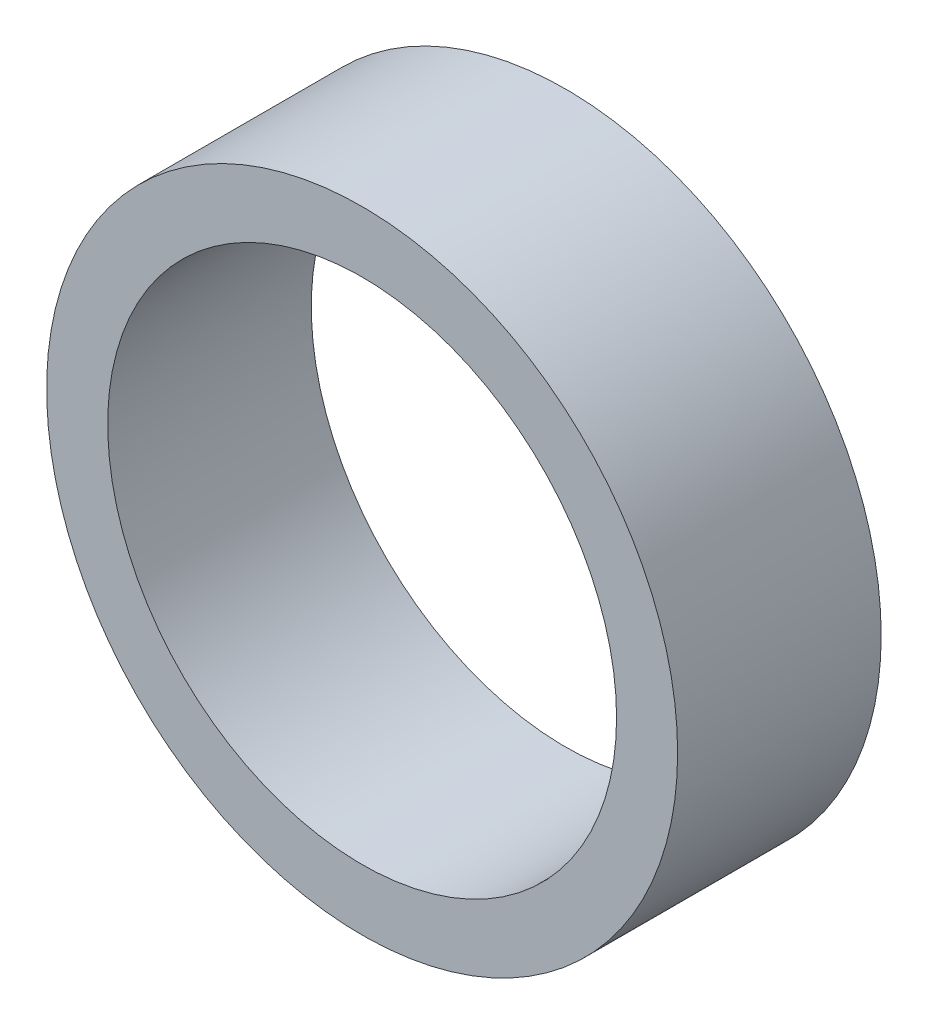
ISO-10303-21;
HEADER;
FILE_DESCRIPTION(('STEP AP214'),'2;1');
FILE_NAME('part.step','',(''),(''),'','','');
FILE_SCHEMA(('AUTOMOTIVE_DESIGN { 1 0 10303 214 1 1 1 1 }'));
ENDSEC;
DATA;
#1=APPLICATION_CONTEXT('core data for automotive mechanical design processes');
#2=APPLICATION_PROTOCOL_DEFINITION('international standard','automotive_design',2000,#1);
#3=PRODUCT_CONTEXT('',#1,'mechanical');
#4=PRODUCT('Part','Part','',(#3));
#5=PRODUCT_RELATED_PRODUCT_CATEGORY('part','',(#4));
#6=PRODUCT_DEFINITION_FORMATION('','',#4);
#7=PRODUCT_DEFINITION_CONTEXT('part definition',#1,'design');
#8=PRODUCT_DEFINITION('design','',#6,#7);
#9=PRODUCT_DEFINITION_SHAPE('','',#8);
#10=(LENGTH_UNIT() NAMED_UNIT(*) SI_UNIT(.MILLI.,.METRE.));
#11=(NAMED_UNIT(*) PLANE_ANGLE_UNIT() SI_UNIT($,.RADIAN.));
#12=(NAMED_UNIT(*) SI_UNIT($,.STERADIAN.) SOLID_ANGLE_UNIT());
#13=UNCERTAINTY_MEASURE_WITH_UNIT(LENGTH_MEASURE(1.E-05),#10,'distance_accuracy_value','');
#14=(GEOMETRIC_REPRESENTATION_CONTEXT(3) GLOBAL_UNCERTAINTY_ASSIGNED_CONTEXT((#13)) GLOBAL_UNIT_ASSIGNED_CONTEXT((#10,
#11,#12)) REPRESENTATION_CONTEXT('',''));
#15=CARTESIAN_POINT('',(0.,0.,0.));
#16=DIRECTION('',(0.,0.,1.));
#17=DIRECTION('',(1.,0.,0.));
#18=AXIS2_PLACEMENT_3D('',#15,#16,#17);
#19=CARTESIAN_POINT('',(0.,0.,10.));
#20=DIRECTION('',(0.,0.,1.));
#21=DIRECTION('',(1.,0.,0.));
#22=AXIS2_PLACEMENT_3D('',#19,#20,#21);
#23=PLANE('',#22);
#24=CARTESIAN_POINT('',(0.,0.,10.));
#25=DIRECTION('',(0.,0.,1.));
#26=DIRECTION('',(1.,0.,0.));
#27=AXIS2_PLACEMENT_3D('',#24,#25,#26);
#28=CIRCLE('',#27,15.5);
#29=CARTESIAN_POINT('',(15.5,0.,10.));
#30=VERTEX_POINT('',#29);
#31=EDGE_CURVE('E10',#30,#30,#28,.T.);
#32=ORIENTED_EDGE('',*,*,#31,.T.);
#33=EDGE_LOOP('',(#32));
#34=FACE_BOUND('',#33,.T.);
#35=CARTESIAN_POINT('',(0.,0.,10.));
#36=DIRECTION('',(0.,0.,1.));
#37=DIRECTION('',(1.,0.,0.));
#38=AXIS2_PLACEMENT_3D('',#35,#36,#37);
#39=CIRCLE('',#38,12.5);
#40=CARTESIAN_POINT('',(12.5,0.,10.));
#41=VERTEX_POINT('',#40);
#42=EDGE_CURVE('E43',#41,#41,#39,.T.);
#43=ORIENTED_EDGE('',*,*,#42,.F.);
#44=EDGE_LOOP('',(#43));
#45=FACE_BOUND('',#44,.T.);
#46=ADVANCED_FACE('F32',(#34,#45),#23,.T.);
#47=CARTESIAN_POINT('',(0.,0.,0.));
#48=DIRECTION('',(0.,0.,1.));
#49=DIRECTION('',(1.,0.,0.));
#50=AXIS2_PLACEMENT_3D('',#47,#48,#49);
#51=PLANE('',#50);
#52=CARTESIAN_POINT('',(0.,0.,0.));
#53=DIRECTION('',(0.,0.,1.));
#54=DIRECTION('',(1.,0.,0.));
#55=AXIS2_PLACEMENT_3D('',#52,#53,#54);
#56=CIRCLE('',#55,15.5);
#57=CARTESIAN_POINT('',(15.5,0.,0.));
#58=VERTEX_POINT('',#57);
#59=EDGE_CURVE('E36',#58,#58,#56,.T.);
#60=ORIENTED_EDGE('',*,*,#59,.F.);
#61=EDGE_LOOP('',(#60));
#62=FACE_BOUND('',#61,.T.);
#63=CARTESIAN_POINT('',(0.,0.,0.));
#64=DIRECTION('',(0.,0.,1.));
#65=DIRECTION('',(1.,0.,0.));
#66=AXIS2_PLACEMENT_3D('',#63,#64,#65);
#67=CIRCLE('',#66,12.5);
#68=CARTESIAN_POINT('',(12.5,0.,0.));
#69=VERTEX_POINT('',#68);
#70=EDGE_CURVE('E45',#69,#69,#67,.T.);
#71=ORIENTED_EDGE('',*,*,#70,.T.);
#72=EDGE_LOOP('',(#71));
#73=FACE_BOUND('',#72,.T.);
#74=ADVANCED_FACE('F55',(#62,#73),#51,.F.);
#75=CARTESIAN_POINT('',(0.,0.,10.));
#76=DIRECTION('',(0.,0.,-1.));
#77=DIRECTION('',(-1.,0.,0.));
#78=AXIS2_PLACEMENT_3D('',#75,#76,#77);
#79=CYLINDRICAL_SURFACE('',#78,15.5);
#80=ORIENTED_EDGE('',*,*,#31,.F.);
#81=EDGE_LOOP('',(#80));
#82=FACE_BOUND('',#81,.T.);
#83=ORIENTED_EDGE('',*,*,#59,.T.);
#84=EDGE_LOOP('',(#83));
#85=FACE_BOUND('',#84,.T.);
#86=ADVANCED_FACE('F34',(#82,#85),#79,.T.);
#87=CARTESIAN_POINT('',(0.,0.,10.));
#88=DIRECTION('',(0.,0.,-1.));
#89=DIRECTION('',(-1.,0.,0.));
#90=AXIS2_PLACEMENT_3D('',#87,#88,#89);
#91=CYLINDRICAL_SURFACE('',#90,12.5);
#92=ORIENTED_EDGE('',*,*,#42,.T.);
#93=EDGE_LOOP('',(#92));
#94=FACE_BOUND('',#93,.T.);
#95=ORIENTED_EDGE('',*,*,#70,.F.);
#96=EDGE_LOOP('',(#95));
#97=FACE_BOUND('',#96,.T.);
#98=ADVANCED_FACE('F51',(#94,#97),#91,.F.);
#99=CLOSED_SHELL('',(#46,#74,#86,#98));
#100=MANIFOLD_SOLID_BREP('B2',#99);
#101=ADVANCED_BREP_SHAPE_REPRESENTATION('',(#18,#100),#14);
#102=SHAPE_DEFINITION_REPRESENTATION(#9,#101);
ENDSEC;
END-ISO-10303-21;
